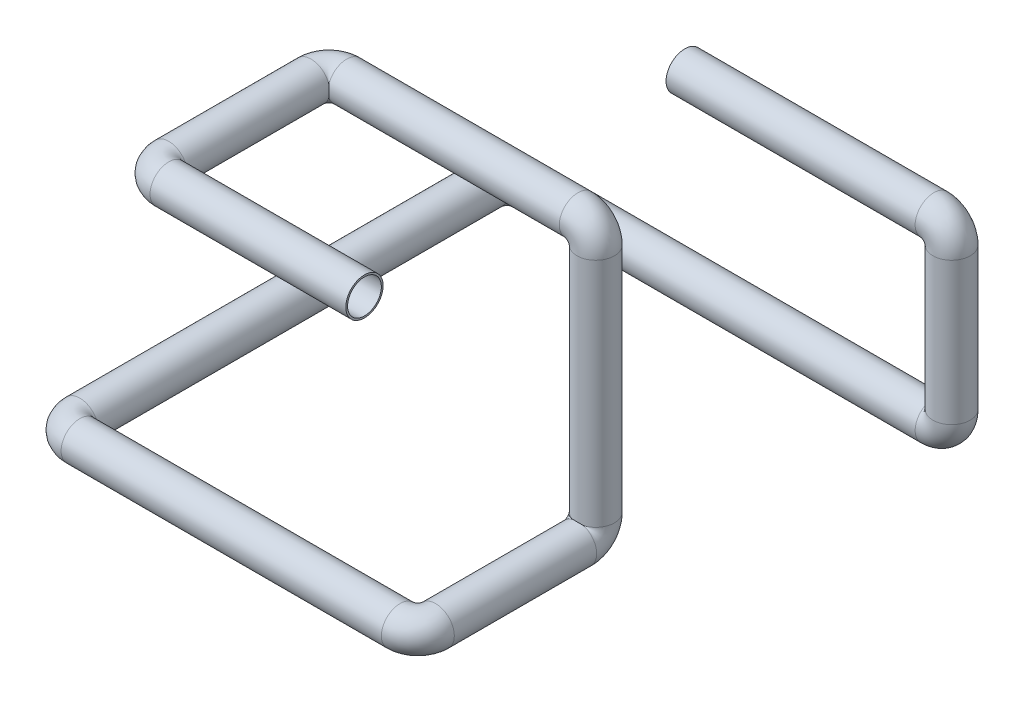
ISO-10303-21;
HEADER;
FILE_DESCRIPTION(('STEP AP214'),'2;1');
FILE_NAME('part.step','',(''),(''),'','','');
FILE_SCHEMA(('AUTOMOTIVE_DESIGN { 1 0 10303 214 1 1 1 1 }'));
ENDSEC;
DATA;
#1=APPLICATION_CONTEXT('core data for automotive mechanical design processes');
#2=APPLICATION_PROTOCOL_DEFINITION('international standard','automotive_design',2000,#1);
#3=PRODUCT_CONTEXT('',#1,'mechanical');
#4=PRODUCT('Part','Part','',(#3));
#5=PRODUCT_RELATED_PRODUCT_CATEGORY('part','',(#4));
#6=PRODUCT_DEFINITION_FORMATION('','',#4);
#7=PRODUCT_DEFINITION_CONTEXT('part definition',#1,'design');
#8=PRODUCT_DEFINITION('design','',#6,#7);
#9=PRODUCT_DEFINITION_SHAPE('','',#8);
#10=(LENGTH_UNIT() NAMED_UNIT(*) SI_UNIT(.MILLI.,.METRE.));
#11=(NAMED_UNIT(*) PLANE_ANGLE_UNIT() SI_UNIT($,.RADIAN.));
#12=(NAMED_UNIT(*) SI_UNIT($,.STERADIAN.) SOLID_ANGLE_UNIT());
#13=UNCERTAINTY_MEASURE_WITH_UNIT(LENGTH_MEASURE(1.E-05),#10,'distance_accuracy_value','');
#14=(GEOMETRIC_REPRESENTATION_CONTEXT(3) GLOBAL_UNCERTAINTY_ASSIGNED_CONTEXT((#13)) GLOBAL_UNIT_ASSIGNED_CONTEXT((#10,
#11,#12)) REPRESENTATION_CONTEXT('',''));
#15=CARTESIAN_POINT('',(0.,0.,0.));
#16=DIRECTION('',(0.,0.,1.));
#17=DIRECTION('',(1.,0.,0.));
#18=AXIS2_PLACEMENT_3D('',#15,#16,#17);
#19=CARTESIAN_POINT('',(0.,0.,0.));
#20=DIRECTION('',(1.,0.,0.));
#21=DIRECTION('',(0.,0.,-1.));
#22=AXIS2_PLACEMENT_3D('',#19,#20,#21);
#23=CYLINDRICAL_SURFACE('',#22,9.49999999999998);
#24=CARTESIAN_POINT('',(140.,0.,0.));
#25=DIRECTION('',(1.,0.,0.));
#26=DIRECTION('',(0.,0.,-1.));
#27=AXIS2_PLACEMENT_3D('',#24,#25,#26);
#28=CIRCLE('',#27,9.49999999999998);
#29=CARTESIAN_POINT('',(140.,9.49999999999998,0.));
#30=VERTEX_POINT('',#29);
#31=EDGE_CURVE('E286',#30,#30,#28,.F.);
#32=ORIENTED_EDGE('',*,*,#31,.F.);
#33=EDGE_LOOP('',(#32));
#34=FACE_BOUND('',#33,.T.);
#35=CARTESIAN_POINT('',(0.,0.,0.));
#36=DIRECTION('',(-1.,0.,0.));
#37=DIRECTION('',(0.,0.,1.));
#38=AXIS2_PLACEMENT_3D('',#35,#36,#37);
#39=CIRCLE('',#38,9.49999999999998);
#40=CARTESIAN_POINT('',(0.,0.,9.49999999999999));
#41=VERTEX_POINT('',#40);
#42=EDGE_CURVE('E283',#41,#41,#39,.T.);
#43=ORIENTED_EDGE('',*,*,#42,.T.);
#44=EDGE_LOOP('',(#43));
#45=FACE_BOUND('',#44,.T.);
#46=ADVANCED_FACE('F51',(#34,#45),#23,.F.);
#47=CARTESIAN_POINT('',(140.,-10.,0.));
#48=DIRECTION('',(0.,0.,-1.));
#49=DIRECTION('',(-1.,0.,0.));
#50=AXIS2_PLACEMENT_3D('',#47,#48,#49);
#51=TOROIDAL_SURFACE('',#50,10.,9.49999999999998);
#52=CARTESIAN_POINT('',(150.,-9.99999999999999,0.));
#53=DIRECTION('',(0.,1.,0.));
#54=DIRECTION('',(-1.,0.,0.));
#55=AXIS2_PLACEMENT_3D('',#52,#53,#54);
#56=CIRCLE('',#55,9.49999999999998);
#57=CARTESIAN_POINT('',(159.5,-9.99999999999999,0.));
#58=VERTEX_POINT('',#57);
#59=EDGE_CURVE('E290',#58,#58,#56,.T.);
#60=CARTESIAN_POINT('',(140.,-10.,0.));
#61=DIRECTION('',(0.,0.,-1.));
#62=DIRECTION('',(-1.,0.,0.));
#63=AXIS2_PLACEMENT_3D('',#60,#61,#62);
#64=CIRCLE('',#63,19.5);
#65=EDGE_CURVE('',#30,#58,#64,.T.);
#66=ORIENTED_EDGE('',*,*,#31,.T.);
#67=ORIENTED_EDGE('',*,*,#59,.F.);
#68=ORIENTED_EDGE('',*,*,#65,.T.);
#69=ORIENTED_EDGE('',*,*,#65,.F.);
#70=EDGE_LOOP('',(#66,#68,#67,#69));
#71=FACE_BOUND('',#70,.T.);
#72=ADVANCED_FACE('F369',(#71),#51,.F.);
#73=CARTESIAN_POINT('',(150.,-9.99999999999999,0.));
#74=DIRECTION('',(0.,-1.,0.));
#75=DIRECTION('',(0.,0.,-1.));
#76=AXIS2_PLACEMENT_3D('',#73,#74,#75);
#77=CYLINDRICAL_SURFACE('',#76,9.49999999999998);
#78=CARTESIAN_POINT('',(150.,-90.,0.));
#79=DIRECTION('',(0.,-1.,0.));
#80=DIRECTION('',(0.,0.,-1.));
#81=AXIS2_PLACEMENT_3D('',#78,#79,#80);
#82=CIRCLE('',#81,9.49999999999998);
#83=CARTESIAN_POINT('',(159.5,-90.,0.));
#84=VERTEX_POINT('',#83);
#85=EDGE_CURVE('E359',#84,#84,#82,.F.);
#86=ORIENTED_EDGE('',*,*,#85,.F.);
#87=EDGE_LOOP('',(#86));
#88=FACE_BOUND('',#87,.T.);
#89=ORIENTED_EDGE('',*,*,#59,.T.);
#90=EDGE_LOOP('',(#89));
#91=FACE_BOUND('',#90,.T.);
#92=ADVANCED_FACE('F367',(#88,#91),#77,.F.);
#93=CARTESIAN_POINT('',(140.,-90.,0.));
#94=DIRECTION('',(0.,0.,-1.));
#95=DIRECTION('',(-1.,0.,0.));
#96=AXIS2_PLACEMENT_3D('',#93,#94,#95);
#97=TOROIDAL_SURFACE('',#96,9.99999999999998,9.49999999999998);
#98=CARTESIAN_POINT('',(140.,-100.,0.));
#99=DIRECTION('',(1.,0.,0.));
#100=DIRECTION('',(0.,1.,0.));
#101=AXIS2_PLACEMENT_3D('',#98,#99,#100);
#102=CIRCLE('',#101,9.49999999999998);
#103=CARTESIAN_POINT('',(140.,-109.5,0.));
#104=VERTEX_POINT('',#103);
#105=EDGE_CURVE('E355',#104,#104,#102,.T.);
#106=CARTESIAN_POINT('',(140.,-90.,0.));
#107=DIRECTION('',(0.,0.,-1.));
#108=DIRECTION('',(-1.,0.,0.));
#109=AXIS2_PLACEMENT_3D('',#106,#107,#108);
#110=CIRCLE('',#109,19.5);
#111=EDGE_CURVE('',#84,#104,#110,.T.);
#112=ORIENTED_EDGE('',*,*,#85,.T.);
#113=ORIENTED_EDGE('',*,*,#105,.F.);
#114=ORIENTED_EDGE('',*,*,#111,.T.);
#115=ORIENTED_EDGE('',*,*,#111,.F.);
#116=EDGE_LOOP('',(#112,#114,#113,#115));
#117=FACE_BOUND('',#116,.T.);
#118=ADVANCED_FACE('F382',(#117),#97,.F.);
#119=CARTESIAN_POINT('',(140.,-100.,0.));
#120=DIRECTION('',(-1.,0.,0.));
#121=DIRECTION('',(0.,0.,1.));
#122=AXIS2_PLACEMENT_3D('',#119,#120,#121);
#123=CYLINDRICAL_SURFACE('',#122,9.49999999999998);
#124=CARTESIAN_POINT('',(-90.,-100.,0.));
#125=DIRECTION('',(-1.,0.,0.));
#126=DIRECTION('',(0.,0.,1.));
#127=AXIS2_PLACEMENT_3D('',#124,#125,#126);
#128=CIRCLE('',#127,9.49999999999998);
#129=CARTESIAN_POINT('',(-90.,-100.,-9.49999999999997));
#130=VERTEX_POINT('',#129);
#131=EDGE_CURVE('E351',#130,#130,#128,.F.);
#132=ORIENTED_EDGE('',*,*,#131,.F.);
#133=EDGE_LOOP('',(#132));
#134=FACE_BOUND('',#133,.T.);
#135=ORIENTED_EDGE('',*,*,#105,.T.);
#136=EDGE_LOOP('',(#135));
#137=FACE_BOUND('',#136,.T.);
#138=ADVANCED_FACE('F386',(#134,#137),#123,.F.);
#139=CARTESIAN_POINT('',(-90.,-100.,10.));
#140=DIRECTION('',(0.,1.,0.));
#141=DIRECTION('',(0.,0.,1.));
#142=AXIS2_PLACEMENT_3D('',#139,#140,#141);
#143=TOROIDAL_SURFACE('',#142,9.99999999999999,9.49999999999998);
#144=CARTESIAN_POINT('',(-100.,-100.,10.));
#145=DIRECTION('',(0.,0.,-1.));
#146=DIRECTION('',(-1.,0.,0.));
#147=AXIS2_PLACEMENT_3D('',#144,#145,#146);
#148=CIRCLE('',#147,9.49999999999998);
#149=CARTESIAN_POINT('',(-109.5,-100.,9.99999999999999));
#150=VERTEX_POINT('',#149);
#151=EDGE_CURVE('E347',#150,#150,#148,.T.);
#152=CARTESIAN_POINT('',(-90.,-100.,10.));
#153=DIRECTION('',(0.,1.,0.));
#154=DIRECTION('',(0.,0.,1.));
#155=AXIS2_PLACEMENT_3D('',#152,#153,#154);
#156=CIRCLE('',#155,19.5);
#157=EDGE_CURVE('',#130,#150,#156,.T.);
#158=ORIENTED_EDGE('',*,*,#131,.T.);
#159=ORIENTED_EDGE('',*,*,#151,.F.);
#160=ORIENTED_EDGE('',*,*,#157,.T.);
#161=ORIENTED_EDGE('',*,*,#157,.F.);
#162=EDGE_LOOP('',(#158,#160,#159,#161));
#163=FACE_BOUND('',#162,.T.);
#164=ADVANCED_FACE('F390',(#163),#143,.F.);
#165=CARTESIAN_POINT('',(-100.,-100.,9.99999999999999));
#166=DIRECTION('',(0.,0.,1.));
#167=DIRECTION('',(1.,0.,0.));
#168=AXIS2_PLACEMENT_3D('',#165,#166,#167);
#169=CYLINDRICAL_SURFACE('',#168,9.49999999999998);
#170=CARTESIAN_POINT('',(-100.,-100.,240.));
#171=DIRECTION('',(0.,0.,1.));
#172=DIRECTION('',(1.,0.,0.));
#173=AXIS2_PLACEMENT_3D('',#170,#171,#172);
#174=CIRCLE('',#173,9.49999999999998);
#175=CARTESIAN_POINT('',(-109.5,-100.,240.));
#176=VERTEX_POINT('',#175);
#177=EDGE_CURVE('E343',#176,#176,#174,.F.);
#178=ORIENTED_EDGE('',*,*,#177,.F.);
#179=EDGE_LOOP('',(#178));
#180=FACE_BOUND('',#179,.T.);
#181=ORIENTED_EDGE('',*,*,#151,.T.);
#182=EDGE_LOOP('',(#181));
#183=FACE_BOUND('',#182,.T.);
#184=ADVANCED_FACE('F394',(#180,#183),#169,.F.);
#185=CARTESIAN_POINT('',(-90.,-100.,240.));
#186=DIRECTION('',(0.,1.,0.));
#187=DIRECTION('',(0.,0.,1.));
#188=AXIS2_PLACEMENT_3D('',#185,#186,#187);
#189=TOROIDAL_SURFACE('',#188,9.99999999999999,9.49999999999998);
#190=CARTESIAN_POINT('',(-90.,-100.,250.));
#191=DIRECTION('',(-1.,0.,0.));
#192=DIRECTION('',(0.,0.,1.));
#193=AXIS2_PLACEMENT_3D('',#190,#191,#192);
#194=CIRCLE('',#193,9.49999999999998);
#195=CARTESIAN_POINT('',(-90.,-100.,259.5));
#196=VERTEX_POINT('',#195);
#197=EDGE_CURVE('E339',#196,#196,#194,.T.);
#198=CARTESIAN_POINT('',(-90.,-100.,240.));
#199=DIRECTION('',(0.,1.,0.));
#200=DIRECTION('',(0.,0.,1.));
#201=AXIS2_PLACEMENT_3D('',#198,#199,#200);
#202=CIRCLE('',#201,19.5);
#203=EDGE_CURVE('',#176,#196,#202,.T.);
#204=ORIENTED_EDGE('',*,*,#177,.T.);
#205=ORIENTED_EDGE('',*,*,#197,.F.);
#206=ORIENTED_EDGE('',*,*,#203,.T.);
#207=ORIENTED_EDGE('',*,*,#203,.F.);
#208=EDGE_LOOP('',(#204,#206,#205,#207));
#209=FACE_BOUND('',#208,.T.);
#210=ADVANCED_FACE('F398',(#209),#189,.F.);
#211=CARTESIAN_POINT('',(-90.,-100.,250.));
#212=DIRECTION('',(1.,0.,0.));
#213=DIRECTION('',(0.,0.,-1.));
#214=AXIS2_PLACEMENT_3D('',#211,#212,#213);
#215=CYLINDRICAL_SURFACE('',#214,9.49999999999998);
#216=CARTESIAN_POINT('',(89.9999999999999,-100.,250.));
#217=DIRECTION('',(1.,0.,0.));
#218=DIRECTION('',(0.,0.,-1.));
#219=AXIS2_PLACEMENT_3D('',#216,#217,#218);
#220=CIRCLE('',#219,9.49999999999998);
#221=CARTESIAN_POINT('',(89.9999999999999,-100.,259.5));
#222=VERTEX_POINT('',#221);
#223=EDGE_CURVE('E335',#222,#222,#220,.F.);
#224=ORIENTED_EDGE('',*,*,#223,.F.);
#225=EDGE_LOOP('',(#224));
#226=FACE_BOUND('',#225,.T.);
#227=ORIENTED_EDGE('',*,*,#197,.T.);
#228=EDGE_LOOP('',(#227));
#229=FACE_BOUND('',#228,.T.);
#230=ADVANCED_FACE('F402',(#226,#229),#215,.F.);
#231=CARTESIAN_POINT('',(90.,-100.,240.));
#232=DIRECTION('',(0.,1.,0.));
#233=DIRECTION('',(0.,0.,1.));
#234=AXIS2_PLACEMENT_3D('',#231,#232,#233);
#235=TOROIDAL_SURFACE('',#234,10.,9.49999999999998);
#236=CARTESIAN_POINT('',(100.,-100.,240.));
#237=DIRECTION('',(0.,0.,1.));
#238=DIRECTION('',(1.,0.,0.));
#239=AXIS2_PLACEMENT_3D('',#236,#237,#238);
#240=CIRCLE('',#239,9.49999999999998);
#241=CARTESIAN_POINT('',(109.5,-100.,240.));
#242=VERTEX_POINT('',#241);
#243=EDGE_CURVE('E331',#242,#242,#240,.T.);
#244=CARTESIAN_POINT('',(90.,-100.,240.));
#245=DIRECTION('',(0.,1.,0.));
#246=DIRECTION('',(0.,0.,1.));
#247=AXIS2_PLACEMENT_3D('',#244,#245,#246);
#248=CIRCLE('',#247,19.5);
#249=EDGE_CURVE('',#222,#242,#248,.T.);
#250=ORIENTED_EDGE('',*,*,#223,.T.);
#251=ORIENTED_EDGE('',*,*,#243,.F.);
#252=ORIENTED_EDGE('',*,*,#249,.T.);
#253=ORIENTED_EDGE('',*,*,#249,.F.);
#254=EDGE_LOOP('',(#250,#252,#251,#253));
#255=FACE_BOUND('',#254,.T.);
#256=ADVANCED_FACE('F406',(#255),#235,.F.);
#257=CARTESIAN_POINT('',(100.,-100.,240.));
#258=DIRECTION('',(0.,0.,-1.));
#259=DIRECTION('',(-1.,0.,0.));
#260=AXIS2_PLACEMENT_3D('',#257,#258,#259);
#261=CYLINDRICAL_SURFACE('',#260,9.49999999999998);
#262=CARTESIAN_POINT('',(100.,-100.,160.));
#263=DIRECTION('',(0.,0.,-1.));
#264=DIRECTION('',(-1.,0.,0.));
#265=AXIS2_PLACEMENT_3D('',#262,#263,#264);
#266=CIRCLE('',#265,9.49999999999998);
#267=CARTESIAN_POINT('',(100.,-109.5,160.));
#268=VERTEX_POINT('',#267);
#269=EDGE_CURVE('E327',#268,#268,#266,.F.);
#270=ORIENTED_EDGE('',*,*,#269,.F.);
#271=EDGE_LOOP('',(#270));
#272=FACE_BOUND('',#271,.T.);
#273=ORIENTED_EDGE('',*,*,#243,.T.);
#274=EDGE_LOOP('',(#273));
#275=FACE_BOUND('',#274,.T.);
#276=ADVANCED_FACE('F410',(#272,#275),#261,.F.);
#277=CARTESIAN_POINT('',(100.,-90.,160.));
#278=DIRECTION('',(1.,0.,0.));
#279=DIRECTION('',(0.,0.,-1.));
#280=AXIS2_PLACEMENT_3D('',#277,#278,#279);
#281=TOROIDAL_SURFACE('',#280,9.99999999999999,9.49999999999998);
#282=CARTESIAN_POINT('',(100.,-90.,150.));
#283=DIRECTION('',(0.,-1.,0.));
#284=DIRECTION('',(0.,0.,-1.));
#285=AXIS2_PLACEMENT_3D('',#282,#283,#284);
#286=CIRCLE('',#285,9.49999999999998);
#287=CARTESIAN_POINT('',(100.,-90.,140.5));
#288=VERTEX_POINT('',#287);
#289=EDGE_CURVE('E323',#288,#288,#286,.T.);
#290=CARTESIAN_POINT('',(100.,-90.,160.));
#291=DIRECTION('',(1.,0.,0.));
#292=DIRECTION('',(0.,0.,-1.));
#293=AXIS2_PLACEMENT_3D('',#290,#291,#292);
#294=CIRCLE('',#293,19.5);
#295=EDGE_CURVE('',#268,#288,#294,.T.);
#296=ORIENTED_EDGE('',*,*,#269,.T.);
#297=ORIENTED_EDGE('',*,*,#289,.F.);
#298=ORIENTED_EDGE('',*,*,#295,.T.);
#299=ORIENTED_EDGE('',*,*,#295,.F.);
#300=EDGE_LOOP('',(#296,#298,#297,#299));
#301=FACE_BOUND('',#300,.T.);
#302=ADVANCED_FACE('F414',(#301),#281,.F.);
#303=CARTESIAN_POINT('',(100.,-90.,150.));
#304=DIRECTION('',(0.,1.,0.));
#305=DIRECTION('',(0.,0.,1.));
#306=AXIS2_PLACEMENT_3D('',#303,#304,#305);
#307=CYLINDRICAL_SURFACE('',#306,9.49999999999998);
#308=CARTESIAN_POINT('',(100.,40.,150.));
#309=DIRECTION('',(0.,1.,0.));
#310=DIRECTION('',(0.,0.,1.));
#311=AXIS2_PLACEMENT_3D('',#308,#309,#310);
#312=CIRCLE('',#311,9.49999999999998);
#313=CARTESIAN_POINT('',(109.5,40.,150.));
#314=VERTEX_POINT('',#313);
#315=EDGE_CURVE('E319',#314,#314,#312,.F.);
#316=ORIENTED_EDGE('',*,*,#315,.F.);
#317=EDGE_LOOP('',(#316));
#318=FACE_BOUND('',#317,.T.);
#319=ORIENTED_EDGE('',*,*,#289,.T.);
#320=EDGE_LOOP('',(#319));
#321=FACE_BOUND('',#320,.T.);
#322=ADVANCED_FACE('F418',(#318,#321),#307,.F.);
#323=CARTESIAN_POINT('',(90.,40.,150.));
#324=DIRECTION('',(0.,0.,1.));
#325=DIRECTION('',(1.,0.,0.));
#326=AXIS2_PLACEMENT_3D('',#323,#324,#325);
#327=TOROIDAL_SURFACE('',#326,9.99999999999999,9.49999999999998);
#328=CARTESIAN_POINT('',(90.,50.,150.));
#329=DIRECTION('',(1.,0.,0.));
#330=DIRECTION('',(0.,1.,0.));
#331=AXIS2_PLACEMENT_3D('',#328,#329,#330);
#332=CIRCLE('',#331,9.49999999999998);
#333=CARTESIAN_POINT('',(90.,59.5,150.));
#334=VERTEX_POINT('',#333);
#335=EDGE_CURVE('E315',#334,#334,#332,.T.);
#336=CARTESIAN_POINT('',(90.,40.,150.));
#337=DIRECTION('',(0.,0.,1.));
#338=DIRECTION('',(1.,0.,0.));
#339=AXIS2_PLACEMENT_3D('',#336,#337,#338);
#340=CIRCLE('',#339,19.5);
#341=EDGE_CURVE('',#314,#334,#340,.T.);
#342=ORIENTED_EDGE('',*,*,#315,.T.);
#343=ORIENTED_EDGE('',*,*,#335,.F.);
#344=ORIENTED_EDGE('',*,*,#341,.T.);
#345=ORIENTED_EDGE('',*,*,#341,.F.);
#346=EDGE_LOOP('',(#342,#344,#343,#345));
#347=FACE_BOUND('',#346,.T.);
#348=ADVANCED_FACE('F422',(#347),#327,.F.);
#349=CARTESIAN_POINT('',(90.,50.,150.));
#350=DIRECTION('',(-1.,0.,0.));
#351=DIRECTION('',(0.,-1.,0.));
#352=AXIS2_PLACEMENT_3D('',#349,#350,#351);
#353=CYLINDRICAL_SURFACE('',#352,9.49999999999998);
#354=CARTESIAN_POINT('',(-40.,50.,150.));
#355=DIRECTION('',(-1.,0.,0.));
#356=DIRECTION('',(0.,-1.,0.));
#357=AXIS2_PLACEMENT_3D('',#354,#355,#356);
#358=CIRCLE('',#357,9.49999999999998);
#359=CARTESIAN_POINT('',(-40.,50.,140.5));
#360=VERTEX_POINT('',#359);
#361=EDGE_CURVE('E309',#360,#360,#358,.F.);
#362=ORIENTED_EDGE('',*,*,#361,.F.);
#363=EDGE_LOOP('',(#362));
#364=FACE_BOUND('',#363,.T.);
#365=ORIENTED_EDGE('',*,*,#335,.T.);
#366=EDGE_LOOP('',(#365));
#367=FACE_BOUND('',#366,.T.);
#368=ADVANCED_FACE('F426',(#364,#367),#353,.F.);
#369=CARTESIAN_POINT('',(-40.,50.,160.));
#370=DIRECTION('',(0.,1.,0.));
#371=DIRECTION('',(0.,0.,1.));
#372=AXIS2_PLACEMENT_3D('',#369,#370,#371);
#373=TOROIDAL_SURFACE('',#372,10.,9.49999999999998);
#374=CARTESIAN_POINT('',(-50.,50.,160.));
#375=DIRECTION('',(0.,0.,-1.));
#376=DIRECTION('',(-1.,0.,0.));
#377=AXIS2_PLACEMENT_3D('',#374,#375,#376);
#378=CIRCLE('',#377,9.49999999999998);
#379=CARTESIAN_POINT('',(-59.5,50.,160.));
#380=VERTEX_POINT('',#379);
#381=EDGE_CURVE('E304',#380,#380,#378,.T.);
#382=CARTESIAN_POINT('',(-40.,50.,160.));
#383=DIRECTION('',(0.,1.,0.));
#384=DIRECTION('',(0.,0.,1.));
#385=AXIS2_PLACEMENT_3D('',#382,#383,#384);
#386=CIRCLE('',#385,19.5);
#387=EDGE_CURVE('',#360,#380,#386,.T.);
#388=ORIENTED_EDGE('',*,*,#361,.T.);
#389=ORIENTED_EDGE('',*,*,#381,.F.);
#390=ORIENTED_EDGE('',*,*,#387,.T.);
#391=ORIENTED_EDGE('',*,*,#387,.F.);
#392=EDGE_LOOP('',(#388,#390,#389,#391));
#393=FACE_BOUND('',#392,.T.);
#394=ADVANCED_FACE('F430',(#393),#373,.F.);
#395=CARTESIAN_POINT('',(-50.,50.,160.));
#396=DIRECTION('',(0.,0.,1.));
#397=DIRECTION('',(1.,0.,0.));
#398=AXIS2_PLACEMENT_3D('',#395,#396,#397);
#399=CYLINDRICAL_SURFACE('',#398,9.49999999999998);
#400=CARTESIAN_POINT('',(-50.,50.,240.));
#401=DIRECTION('',(0.,0.,1.));
#402=DIRECTION('',(1.,0.,0.));
#403=AXIS2_PLACEMENT_3D('',#400,#401,#402);
#404=CIRCLE('',#403,9.49999999999998);
#405=CARTESIAN_POINT('',(-59.5,50.,240.));
#406=VERTEX_POINT('',#405);
#407=EDGE_CURVE('E300',#406,#406,#404,.F.);
#408=ORIENTED_EDGE('',*,*,#407,.F.);
#409=EDGE_LOOP('',(#408));
#410=FACE_BOUND('',#409,.T.);
#411=ORIENTED_EDGE('',*,*,#381,.T.);
#412=EDGE_LOOP('',(#411));
#413=FACE_BOUND('',#412,.T.);
#414=ADVANCED_FACE('F257',(#410,#413),#399,.F.);
#415=CARTESIAN_POINT('',(-40.,50.,240.));
#416=DIRECTION('',(0.,1.,0.));
#417=DIRECTION('',(-1.,0.,0.));
#418=AXIS2_PLACEMENT_3D('',#415,#416,#417);
#419=TOROIDAL_SURFACE('',#418,10.,9.49999999999998);
#420=CARTESIAN_POINT('',(-39.9999999999999,50.,250.));
#421=DIRECTION('',(-1.,0.,0.));
#422=DIRECTION('',(0.,0.,1.));
#423=AXIS2_PLACEMENT_3D('',#420,#421,#422);
#424=CIRCLE('',#423,9.49999999999998);
#425=CARTESIAN_POINT('',(-39.9999999999998,50.,259.5));
#426=VERTEX_POINT('',#425);
#427=EDGE_CURVE('E293',#426,#426,#424,.T.);
#428=CARTESIAN_POINT('',(-40.,50.,240.));
#429=DIRECTION('',(0.,1.,0.));
#430=DIRECTION('',(-1.,0.,0.));
#431=AXIS2_PLACEMENT_3D('',#428,#429,#430);
#432=CIRCLE('',#431,19.5);
#433=EDGE_CURVE('',#406,#426,#432,.T.);
#434=ORIENTED_EDGE('',*,*,#407,.T.);
#435=ORIENTED_EDGE('',*,*,#427,.F.);
#436=ORIENTED_EDGE('',*,*,#433,.T.);
#437=ORIENTED_EDGE('',*,*,#433,.F.);
#438=EDGE_LOOP('',(#434,#436,#435,#437));
#439=FACE_BOUND('',#438,.T.);
#440=ADVANCED_FACE('F250',(#439),#419,.F.);
#441=CARTESIAN_POINT('',(-40.,50.,250.));
#442=DIRECTION('',(1.,0.,0.));
#443=DIRECTION('',(0.,1.,0.));
#444=AXIS2_PLACEMENT_3D('',#441,#442,#443);
#445=CYLINDRICAL_SURFACE('',#444,9.49999999999998);
#446=CARTESIAN_POINT('',(70.,50.,250.));
#447=DIRECTION('',(-1.,0.,0.));
#448=DIRECTION('',(0.,-1.,0.));
#449=AXIS2_PLACEMENT_3D('',#446,#447,#448);
#450=CIRCLE('',#449,9.49999999999998);
#451=CARTESIAN_POINT('',(70.,40.5,250.));
#452=VERTEX_POINT('',#451);
#453=EDGE_CURVE('E213',#452,#452,#450,.T.);
#454=ORIENTED_EDGE('',*,*,#453,.F.);
#455=EDGE_LOOP('',(#454));
#456=FACE_BOUND('',#455,.T.);
#457=ORIENTED_EDGE('',*,*,#427,.T.);
#458=EDGE_LOOP('',(#457));
#459=FACE_BOUND('',#458,.T.);
#460=ADVANCED_FACE('F248',(#456,#459),#445,.F.);
#461=CARTESIAN_POINT('',(150.,-9.99999999999999,0.));
#462=DIRECTION('',(0.,-1.,0.));
#463=DIRECTION('',(0.,0.,-1.));
#464=AXIS2_PLACEMENT_3D('',#461,#462,#463);
#465=CYLINDRICAL_SURFACE('',#464,10.5);
#466=CARTESIAN_POINT('',(150.,-100.,0.));
#467=DIRECTION('',(-0.707106781186547,-0.707106781186547,0.));
#468=DIRECTION('',(0.707106781186547,-0.707106781186547,0.));
#469=AXIS2_PLACEMENT_3D('',#466,#467,#468);
#470=ELLIPSE('',#469,14.8492424049175,10.5);
#471=CARTESIAN_POINT('',(140.,-90.,3.20156211871638));
#472=VERTEX_POINT('',#471);
#473=CARTESIAN_POINT('',(140.,-90.,-3.20156211871642));
#474=VERTEX_POINT('',#473);
#475=EDGE_CURVE('E60',#472,#474,#470,.T.);
#476=ORIENTED_EDGE('',*,*,#475,.F.);
#477=CARTESIAN_POINT('',(150.,-90.,0.));
#478=DIRECTION('',(0.,-1.,0.));
#479=DIRECTION('',(0.,0.,-1.));
#480=AXIS2_PLACEMENT_3D('',#477,#478,#479);
#481=CIRCLE('',#480,10.5);
#482=EDGE_CURVE('E135',#472,#474,#481,.F.);
#483=ORIENTED_EDGE('',*,*,#482,.T.);
#484=EDGE_LOOP('',(#476,#483));
#485=FACE_BOUND('',#484,.T.);
#486=CARTESIAN_POINT('',(150.,-9.99999999999999,0.));
#487=DIRECTION('',(0.,1.,0.));
#488=DIRECTION('',(-1.,0.,0.));
#489=AXIS2_PLACEMENT_3D('',#486,#487,#488);
#490=CIRCLE('',#489,10.5);
#491=CARTESIAN_POINT('',(140.,-10.,3.20156211871623));
#492=VERTEX_POINT('',#491);
#493=CARTESIAN_POINT('',(140.,-10.,-3.20156211871636));
#494=VERTEX_POINT('',#493);
#495=EDGE_CURVE('E129',#492,#494,#490,.T.);
#496=ORIENTED_EDGE('',*,*,#495,.F.);
#497=CARTESIAN_POINT('',(150.,0.,0.));
#498=DIRECTION('',(0.707106781186547,-0.707106781186547,0.));
#499=DIRECTION('',(0.707106781186547,0.707106781186547,0.));
#500=AXIS2_PLACEMENT_3D('',#497,#498,#499);
#501=ELLIPSE('',#500,14.8492424049175,10.5);
#502=EDGE_CURVE('E12',#492,#494,#501,.T.);
#503=ORIENTED_EDGE('',*,*,#502,.T.);
#504=EDGE_LOOP('',(#496,#503));
#505=FACE_BOUND('',#504,.T.);
#506=ADVANCED_FACE('F133',(#485,#505),#465,.T.);
#507=CARTESIAN_POINT('',(0.,0.,0.));
#508=DIRECTION('',(1.,0.,0.));
#509=DIRECTION('',(0.,0.,-1.));
#510=AXIS2_PLACEMENT_3D('',#507,#508,#509);
#511=CYLINDRICAL_SURFACE('',#510,10.5);
#512=CARTESIAN_POINT('',(0.,0.,0.));
#513=DIRECTION('',(-1.,0.,0.));
#514=DIRECTION('',(0.,0.,1.));
#515=AXIS2_PLACEMENT_3D('',#512,#513,#514);
#516=CIRCLE('',#515,10.5);
#517=CARTESIAN_POINT('',(0.,0.,10.5));
#518=VERTEX_POINT('',#517);
#519=EDGE_CURVE('E131',#518,#518,#516,.T.);
#520=ORIENTED_EDGE('',*,*,#519,.F.);
#521=EDGE_LOOP('',(#520));
#522=FACE_BOUND('',#521,.T.);
#523=ORIENTED_EDGE('',*,*,#502,.F.);
#524=CARTESIAN_POINT('',(140.,0.,0.));
#525=DIRECTION('',(1.,0.,0.));
#526=DIRECTION('',(0.,0.,-1.));
#527=AXIS2_PLACEMENT_3D('',#524,#525,#526);
#528=CIRCLE('',#527,10.5);
#529=EDGE_CURVE('E123',#492,#494,#528,.F.);
#530=ORIENTED_EDGE('',*,*,#529,.T.);
#531=EDGE_LOOP('',(#523,#530));
#532=FACE_BOUND('',#531,.T.);
#533=ADVANCED_FACE('F122',(#522,#532),#511,.T.);
#534=CARTESIAN_POINT('',(140.,-100.,0.));
#535=DIRECTION('',(-1.,0.,0.));
#536=DIRECTION('',(0.,0.,1.));
#537=AXIS2_PLACEMENT_3D('',#534,#535,#536);
#538=CYLINDRICAL_SURFACE('',#537,10.5);
#539=CARTESIAN_POINT('',(-100.,-100.,0.));
#540=DIRECTION('',(-0.707106781186547,0.,0.707106781186548));
#541=DIRECTION('',(-0.707106781186547,0.,-0.707106781186547));
#542=AXIS2_PLACEMENT_3D('',#539,#540,#541);
#543=ELLIPSE('',#542,14.8492424049175,10.5);
#544=CARTESIAN_POINT('',(-90.,-103.201562118716,9.99999999999999));
#545=VERTEX_POINT('',#544);
#546=CARTESIAN_POINT('',(-90.,-96.7984378812836,10.));
#547=VERTEX_POINT('',#546);
#548=EDGE_CURVE('E224',#545,#547,#543,.T.);
#549=ORIENTED_EDGE('',*,*,#548,.F.);
#550=CARTESIAN_POINT('',(-90.,-100.,0.));
#551=DIRECTION('',(-1.,0.,0.));
#552=DIRECTION('',(0.,0.,1.));
#553=AXIS2_PLACEMENT_3D('',#550,#551,#552);
#554=CIRCLE('',#553,10.5);
#555=EDGE_CURVE('E146',#545,#547,#554,.F.);
#556=ORIENTED_EDGE('',*,*,#555,.T.);
#557=EDGE_LOOP('',(#549,#556));
#558=FACE_BOUND('',#557,.T.);
#559=CARTESIAN_POINT('',(140.,-100.,0.));
#560=DIRECTION('',(1.,0.,0.));
#561=DIRECTION('',(0.,1.,0.));
#562=AXIS2_PLACEMENT_3D('',#559,#560,#561);
#563=CIRCLE('',#562,10.5);
#564=EDGE_CURVE('E139',#472,#474,#563,.T.);
#565=ORIENTED_EDGE('',*,*,#564,.F.);
#566=ORIENTED_EDGE('',*,*,#475,.T.);
#567=EDGE_LOOP('',(#565,#566));
#568=FACE_BOUND('',#567,.T.);
#569=ADVANCED_FACE('F229',(#558,#568),#538,.T.);
#570=CARTESIAN_POINT('',(-100.,-100.,9.99999999999999));
#571=DIRECTION('',(0.,0.,1.));
#572=DIRECTION('',(1.,0.,0.));
#573=AXIS2_PLACEMENT_3D('',#570,#571,#572);
#574=CYLINDRICAL_SURFACE('',#573,10.5);
#575=CARTESIAN_POINT('',(-100.,-100.,250.));
#576=DIRECTION('',(0.707106781186547,0.,0.707106781186547));
#577=DIRECTION('',(-0.707106781186547,0.,0.707106781186548));
#578=AXIS2_PLACEMENT_3D('',#575,#576,#577);
#579=ELLIPSE('',#578,14.8492424049175,10.5);
#580=CARTESIAN_POINT('',(-90.,-103.201562118717,240.));
#581=VERTEX_POINT('',#580);
#582=CARTESIAN_POINT('',(-90.,-96.7984378812836,240.));
#583=VERTEX_POINT('',#582);
#584=EDGE_CURVE('E221',#581,#583,#579,.T.);
#585=ORIENTED_EDGE('',*,*,#584,.F.);
#586=CARTESIAN_POINT('',(-100.,-100.,240.));
#587=DIRECTION('',(0.,0.,1.));
#588=DIRECTION('',(1.,0.,0.));
#589=AXIS2_PLACEMENT_3D('',#586,#587,#588);
#590=CIRCLE('',#589,10.5);
#591=EDGE_CURVE('E154',#581,#583,#590,.F.);
#592=ORIENTED_EDGE('',*,*,#591,.T.);
#593=EDGE_LOOP('',(#585,#592));
#594=FACE_BOUND('',#593,.T.);
#595=CARTESIAN_POINT('',(-100.,-100.,10.));
#596=DIRECTION('',(0.,0.,-1.));
#597=DIRECTION('',(-1.,0.,0.));
#598=AXIS2_PLACEMENT_3D('',#595,#596,#597);
#599=CIRCLE('',#598,10.5);
#600=EDGE_CURVE('E150',#545,#547,#599,.T.);
#601=ORIENTED_EDGE('',*,*,#600,.F.);
#602=ORIENTED_EDGE('',*,*,#548,.T.);
#603=EDGE_LOOP('',(#601,#602));
#604=FACE_BOUND('',#603,.T.);
#605=ADVANCED_FACE('F277',(#594,#604),#574,.T.);
#606=CARTESIAN_POINT('',(-90.,-100.,250.));
#607=DIRECTION('',(1.,0.,0.));
#608=DIRECTION('',(0.,0.,-1.));
#609=AXIS2_PLACEMENT_3D('',#606,#607,#608);
#610=CYLINDRICAL_SURFACE('',#609,10.5);
#611=CARTESIAN_POINT('',(100.,-100.,250.));
#612=DIRECTION('',(0.707106781186547,0.,-0.707106781186547));
#613=DIRECTION('',(0.707106781186547,0.,0.707106781186548));
#614=AXIS2_PLACEMENT_3D('',#611,#612,#613);
#615=ELLIPSE('',#614,14.8492424049175,10.5);
#616=CARTESIAN_POINT('',(89.9999999999999,-103.201562118716,240.));
#617=VERTEX_POINT('',#616);
#618=CARTESIAN_POINT('',(90.,-96.7984378812837,240.));
#619=VERTEX_POINT('',#618);
#620=EDGE_CURVE('E73',#617,#619,#615,.T.);
#621=ORIENTED_EDGE('',*,*,#620,.F.);
#622=CARTESIAN_POINT('',(89.9999999999999,-100.,250.));
#623=DIRECTION('',(1.,0.,0.));
#624=DIRECTION('',(0.,0.,-1.));
#625=AXIS2_PLACEMENT_3D('',#622,#623,#624);
#626=CIRCLE('',#625,10.5);
#627=EDGE_CURVE('E162',#617,#619,#626,.F.);
#628=ORIENTED_EDGE('',*,*,#627,.T.);
#629=EDGE_LOOP('',(#621,#628));
#630=FACE_BOUND('',#629,.T.);
#631=CARTESIAN_POINT('',(-90.,-100.,250.));
#632=DIRECTION('',(-1.,0.,0.));
#633=DIRECTION('',(0.,0.,1.));
#634=AXIS2_PLACEMENT_3D('',#631,#632,#633);
#635=CIRCLE('',#634,10.5);
#636=EDGE_CURVE('E158',#581,#583,#635,.T.);
#637=ORIENTED_EDGE('',*,*,#636,.F.);
#638=ORIENTED_EDGE('',*,*,#584,.T.);
#639=EDGE_LOOP('',(#637,#638));
#640=FACE_BOUND('',#639,.T.);
#641=ADVANCED_FACE('F501',(#630,#640),#610,.T.);
#642=CARTESIAN_POINT('',(100.,-100.,240.));
#643=DIRECTION('',(0.,0.,-1.));
#644=DIRECTION('',(-1.,0.,0.));
#645=AXIS2_PLACEMENT_3D('',#642,#643,#644);
#646=CYLINDRICAL_SURFACE('',#645,10.5);
#647=CARTESIAN_POINT('',(100.,-100.,160.));
#648=DIRECTION('',(0.,0.,-1.));
#649=DIRECTION('',(-1.,0.,0.));
#650=AXIS2_PLACEMENT_3D('',#647,#648,#649);
#651=CIRCLE('',#650,10.5);
#652=CARTESIAN_POINT('',(96.7984378812837,-90.,160.));
#653=VERTEX_POINT('',#652);
#654=CARTESIAN_POINT('',(103.201562118717,-90.0000000000001,160.));
#655=VERTEX_POINT('',#654);
#656=EDGE_CURVE('E169',#653,#655,#651,.F.);
#657=ORIENTED_EDGE('',*,*,#656,.T.);
#658=CARTESIAN_POINT('',(100.,-100.,150.));
#659=DIRECTION('',(0.,0.707106781186547,-0.707106781186547));
#660=DIRECTION('',(0.,-0.707106781186547,-0.707106781186547));
#661=AXIS2_PLACEMENT_3D('',#658,#659,#660);
#662=ELLIPSE('',#661,14.8492424049175,10.5);
#663=EDGE_CURVE('E198',#653,#655,#662,.T.);
#664=ORIENTED_EDGE('',*,*,#663,.F.);
#665=EDGE_LOOP('',(#657,#664));
#666=FACE_BOUND('',#665,.T.);
#667=CARTESIAN_POINT('',(100.,-100.,240.));
#668=DIRECTION('',(0.,0.,1.));
#669=DIRECTION('',(1.,0.,0.));
#670=AXIS2_PLACEMENT_3D('',#667,#668,#669);
#671=CIRCLE('',#670,10.5);
#672=EDGE_CURVE('E165',#617,#619,#671,.T.);
#673=ORIENTED_EDGE('',*,*,#672,.F.);
#674=ORIENTED_EDGE('',*,*,#620,.T.);
#675=EDGE_LOOP('',(#673,#674));
#676=FACE_BOUND('',#675,.T.);
#677=ADVANCED_FACE('F511',(#666,#676),#646,.T.);
#678=CARTESIAN_POINT('',(90.,50.,150.));
#679=DIRECTION('',(-1.,0.,0.));
#680=DIRECTION('',(0.,-1.,0.));
#681=AXIS2_PLACEMENT_3D('',#678,#679,#680);
#682=CYLINDRICAL_SURFACE('',#681,10.5);
#683=CARTESIAN_POINT('',(-40.,50.,150.));
#684=DIRECTION('',(-1.,0.,0.));
#685=DIRECTION('',(0.,-1.,0.));
#686=AXIS2_PLACEMENT_3D('',#683,#684,#685);
#687=CIRCLE('',#686,10.5);
#688=CARTESIAN_POINT('',(-40.0000000000001,46.7984378812836,160.));
#689=VERTEX_POINT('',#688);
#690=CARTESIAN_POINT('',(-40.,53.2015621187163,160.));
#691=VERTEX_POINT('',#690);
#692=EDGE_CURVE('E183',#689,#691,#687,.F.);
#693=ORIENTED_EDGE('',*,*,#692,.T.);
#694=CARTESIAN_POINT('',(-50.,50.,150.));
#695=DIRECTION('',(-0.707106781186548,0.,0.707106781186548));
#696=DIRECTION('',(-0.707106781186547,0.,-0.707106781186547));
#697=AXIS2_PLACEMENT_3D('',#694,#695,#696);
#698=ELLIPSE('',#697,14.8492424049175,10.5);
#699=EDGE_CURVE('E202',#689,#691,#698,.T.);
#700=ORIENTED_EDGE('',*,*,#699,.F.);
#701=EDGE_LOOP('',(#693,#700));
#702=FACE_BOUND('',#701,.T.);
#703=CARTESIAN_POINT('',(90.,50.,150.));
#704=DIRECTION('',(1.,0.,0.));
#705=DIRECTION('',(0.,1.,0.));
#706=AXIS2_PLACEMENT_3D('',#703,#704,#705);
#707=CIRCLE('',#706,10.5);
#708=CARTESIAN_POINT('',(90.,40.0000000000001,146.798437881283));
#709=VERTEX_POINT('',#708);
#710=CARTESIAN_POINT('',(90.,40.,153.201562118716));
#711=VERTEX_POINT('',#710);
#712=EDGE_CURVE('E179',#709,#711,#707,.T.);
#713=ORIENTED_EDGE('',*,*,#712,.F.);
#714=CARTESIAN_POINT('',(100.,50.,150.));
#715=DIRECTION('',(-0.707106781186547,0.707106781186548,0.));
#716=DIRECTION('',(0.707106781186548,0.707106781186547,0.));
#717=AXIS2_PLACEMENT_3D('',#714,#715,#716);
#718=ELLIPSE('',#717,14.8492424049175,10.5);
#719=EDGE_CURVE('E66',#709,#711,#718,.T.);
#720=ORIENTED_EDGE('',*,*,#719,.T.);
#721=EDGE_LOOP('',(#713,#720));
#722=FACE_BOUND('',#721,.T.);
#723=ADVANCED_FACE('F521',(#702,#722),#682,.T.);
#724=CARTESIAN_POINT('',(100.,-90.,150.));
#725=DIRECTION('',(0.,1.,0.));
#726=DIRECTION('',(0.,0.,1.));
#727=AXIS2_PLACEMENT_3D('',#724,#725,#726);
#728=CYLINDRICAL_SURFACE('',#727,10.5);
#729=CARTESIAN_POINT('',(100.,-90.,150.));
#730=DIRECTION('',(0.,-1.,0.));
#731=DIRECTION('',(0.,0.,-1.));
#732=AXIS2_PLACEMENT_3D('',#729,#730,#731);
#733=CIRCLE('',#732,10.5);
#734=EDGE_CURVE('E172',#653,#655,#733,.T.);
#735=ORIENTED_EDGE('',*,*,#734,.F.);
#736=ORIENTED_EDGE('',*,*,#663,.T.);
#737=EDGE_LOOP('',(#735,#736));
#738=FACE_BOUND('',#737,.T.);
#739=ORIENTED_EDGE('',*,*,#719,.F.);
#740=CARTESIAN_POINT('',(100.,40.,150.));
#741=DIRECTION('',(0.,1.,0.));
#742=DIRECTION('',(0.,0.,1.));
#743=AXIS2_PLACEMENT_3D('',#740,#741,#742);
#744=CIRCLE('',#743,10.5);
#745=EDGE_CURVE('E176',#709,#711,#744,.F.);
#746=ORIENTED_EDGE('',*,*,#745,.T.);
#747=EDGE_LOOP('',(#739,#746));
#748=FACE_BOUND('',#747,.T.);
#749=ADVANCED_FACE('F270',(#738,#748),#728,.T.);
#750=CARTESIAN_POINT('',(0.,0.,0.));
#751=DIRECTION('',(-1.,0.,0.));
#752=DIRECTION('',(0.,0.,1.));
#753=AXIS2_PLACEMENT_3D('',#750,#751,#752);
#754=PLANE('',#753);
#755=ORIENTED_EDGE('',*,*,#519,.T.);
#756=EDGE_LOOP('',(#755));
#757=FACE_BOUND('',#756,.T.);
#758=ORIENTED_EDGE('',*,*,#42,.F.);
#759=EDGE_LOOP('',(#758));
#760=FACE_BOUND('',#759,.T.);
#761=ADVANCED_FACE('F266',(#757,#760),#754,.T.);
#762=CARTESIAN_POINT('',(70.,50.,250.));
#763=DIRECTION('',(-1.,0.,0.));
#764=DIRECTION('',(0.,-1.,0.));
#765=AXIS2_PLACEMENT_3D('',#762,#763,#764);
#766=PLANE('',#765);
#767=CARTESIAN_POINT('',(70.,50.,250.));
#768=DIRECTION('',(-1.,0.,0.));
#769=DIRECTION('',(0.,-1.,0.));
#770=AXIS2_PLACEMENT_3D('',#767,#768,#769);
#771=CIRCLE('',#770,10.5);
#772=CARTESIAN_POINT('',(70.,39.5,250.));
#773=VERTEX_POINT('',#772);
#774=EDGE_CURVE('E197',#773,#773,#771,.T.);
#775=ORIENTED_EDGE('',*,*,#774,.F.);
#776=EDGE_LOOP('',(#775));
#777=FACE_BOUND('',#776,.T.);
#778=ORIENTED_EDGE('',*,*,#453,.T.);
#779=EDGE_LOOP('',(#778));
#780=FACE_BOUND('',#779,.T.);
#781=ADVANCED_FACE('F244',(#777,#780),#766,.F.);
#782=CARTESIAN_POINT('',(130.,-10.,0.));
#783=DIRECTION('',(0.,-1.,0.));
#784=DIRECTION('',(-1.,0.,0.));
#785=AXIS2_PLACEMENT_3D('',#782,#783,#784);
#786=CIRCLE('',#785,10.5);
#787=TRIMMED_CURVE('',#786,(PARAMETER_VALUE(-2.83174801384817)),
(PARAMETER_VALUE(2.83174801384817)),.T.,.PARAMETER.);
#788=CARTESIAN_POINT('',(140.,-10.,0.));
#789=DIRECTION('',(0.,0.,-1.));
#790=AXIS1_PLACEMENT('',#788,#789);
#791=SURFACE_OF_REVOLUTION('',#787,#790);
#792=ORIENTED_EDGE('',*,*,#495,.T.);
#793=ORIENTED_EDGE('',*,*,#529,.F.);
#794=EDGE_LOOP('',(#792,#793));
#795=FACE_BOUND('',#794,.T.);
#796=ADVANCED_FACE('F128',(#795),#791,.T.);
#797=CARTESIAN_POINT('',(130.,-90.,0.));
#798=DIRECTION('',(0.,-1.,0.));
#799=DIRECTION('',(-1.,0.,0.));
#800=AXIS2_PLACEMENT_3D('',#797,#798,#799);
#801=CIRCLE('',#800,10.5);
#802=TRIMMED_CURVE('',#801,(PARAMETER_VALUE(-2.83174801384817)),
(PARAMETER_VALUE(2.83174801384817)),.T.,.PARAMETER.);
#803=CARTESIAN_POINT('',(140.,-90.,0.));
#804=DIRECTION('',(0.,0.,-1.));
#805=AXIS1_PLACEMENT('',#803,#804);
#806=SURFACE_OF_REVOLUTION('',#802,#805);
#807=ORIENTED_EDGE('',*,*,#564,.T.);
#808=ORIENTED_EDGE('',*,*,#482,.F.);
#809=EDGE_LOOP('',(#807,#808));
#810=FACE_BOUND('',#809,.T.);
#811=ADVANCED_FACE('F233',(#810),#806,.T.);
#812=CARTESIAN_POINT('',(-90.,-100.,20.));
#813=DIRECTION('',(-1.,0.,0.));
#814=DIRECTION('',(0.,0.,1.));
#815=AXIS2_PLACEMENT_3D('',#812,#813,#814);
#816=CIRCLE('',#815,10.5);
#817=TRIMMED_CURVE('',#816,(PARAMETER_VALUE(-2.83174801384817)),
(PARAMETER_VALUE(2.83174801384817)),.T.,.PARAMETER.);
#818=CARTESIAN_POINT('',(-90.,-100.,10.));
#819=DIRECTION('',(0.,1.,0.));
#820=AXIS1_PLACEMENT('',#818,#819);
#821=SURFACE_OF_REVOLUTION('',#817,#820);
#822=ORIENTED_EDGE('',*,*,#600,.T.);
#823=ORIENTED_EDGE('',*,*,#555,.F.);
#824=EDGE_LOOP('',(#822,#823));
#825=FACE_BOUND('',#824,.T.);
#826=ADVANCED_FACE('F235',(#825),#821,.T.);
#827=CARTESIAN_POINT('',(-90.,-100.,250.));
#828=DIRECTION('',(-1.,0.,0.));
#829=DIRECTION('',(0.,0.,1.));
#830=AXIS2_PLACEMENT_3D('',#827,#828,#829);
#831=CIRCLE('',#830,10.5);
#832=TRIMMED_CURVE('',#831,(PARAMETER_VALUE(-2.83174801384817)),
(PARAMETER_VALUE(2.83174801384817)),.T.,.PARAMETER.);
#833=CARTESIAN_POINT('',(-90.,-100.,240.));
#834=DIRECTION('',(0.,1.,0.));
#835=AXIS1_PLACEMENT('',#833,#834);
#836=SURFACE_OF_REVOLUTION('',#832,#835);
#837=ORIENTED_EDGE('',*,*,#636,.T.);
#838=ORIENTED_EDGE('',*,*,#591,.F.);
#839=EDGE_LOOP('',(#837,#838));
#840=FACE_BOUND('',#839,.T.);
#841=ADVANCED_FACE('F241',(#840),#836,.T.);
#842=CARTESIAN_POINT('',(90.,-100.,250.));
#843=DIRECTION('',(-1.,0.,0.));
#844=DIRECTION('',(0.,0.,1.));
#845=AXIS2_PLACEMENT_3D('',#842,#843,#844);
#846=CIRCLE('',#845,10.5);
#847=TRIMMED_CURVE('',#846,(PARAMETER_VALUE(-2.83174801384817)),
(PARAMETER_VALUE(2.83174801384817)),.T.,.PARAMETER.);
#848=CARTESIAN_POINT('',(90.,-100.,240.));
#849=DIRECTION('',(0.,1.,0.));
#850=AXIS1_PLACEMENT('',#848,#849);
#851=SURFACE_OF_REVOLUTION('',#847,#850);
#852=ORIENTED_EDGE('',*,*,#672,.T.);
#853=ORIENTED_EDGE('',*,*,#627,.F.);
#854=EDGE_LOOP('',(#852,#853));
#855=FACE_BOUND('',#854,.T.);
#856=ADVANCED_FACE('F577',(#855),#851,.T.);
#857=CARTESIAN_POINT('',(100.,-90.,150.));
#858=DIRECTION('',(0.,-1.,0.));
#859=DIRECTION('',(0.,0.,-1.));
#860=AXIS2_PLACEMENT_3D('',#857,#858,#859);
#861=CIRCLE('',#860,10.5);
#862=TRIMMED_CURVE('',#861,(PARAMETER_VALUE(-2.83174801384817)),
(PARAMETER_VALUE(2.83174801384817)),.T.,.PARAMETER.);
#863=CARTESIAN_POINT('',(100.,-90.,160.));
#864=DIRECTION('',(1.,0.,0.));
#865=AXIS1_PLACEMENT('',#863,#864);
#866=SURFACE_OF_REVOLUTION('',#862,#865);
#867=ORIENTED_EDGE('',*,*,#734,.T.);
#868=ORIENTED_EDGE('',*,*,#656,.F.);
#869=EDGE_LOOP('',(#867,#868));
#870=FACE_BOUND('',#869,.T.);
#871=ADVANCED_FACE('F587',(#870),#866,.T.);
#872=CARTESIAN_POINT('',(100.,40.,150.));
#873=DIRECTION('',(0.,-1.,0.));
#874=DIRECTION('',(1.,0.,0.));
#875=AXIS2_PLACEMENT_3D('',#872,#873,#874);
#876=CIRCLE('',#875,10.5);
#877=TRIMMED_CURVE('',#876,(PARAMETER_VALUE(-2.83174801384817)),
(PARAMETER_VALUE(2.83174801384817)),.T.,.PARAMETER.);
#878=CARTESIAN_POINT('',(90.,40.,150.));
#879=DIRECTION('',(0.,0.,1.));
#880=AXIS1_PLACEMENT('',#878,#879);
#881=SURFACE_OF_REVOLUTION('',#877,#880);
#882=ORIENTED_EDGE('',*,*,#712,.T.);
#883=ORIENTED_EDGE('',*,*,#745,.F.);
#884=EDGE_LOOP('',(#882,#883));
#885=FACE_BOUND('',#884,.T.);
#886=ADVANCED_FACE('F597',(#885),#881,.T.);
#887=CARTESIAN_POINT('',(-40.,50.,170.));
#888=DIRECTION('',(-1.,0.,0.));
#889=DIRECTION('',(0.,0.,1.));
#890=AXIS2_PLACEMENT_3D('',#887,#888,#889);
#891=CIRCLE('',#890,10.5);
#892=TRIMMED_CURVE('',#891,(PARAMETER_VALUE(-2.83174801384818)),
(PARAMETER_VALUE(2.83174801384818)),.T.,.PARAMETER.);
#893=CARTESIAN_POINT('',(-40.,50.,160.));
#894=DIRECTION('',(0.,1.,0.));
#895=AXIS1_PLACEMENT('',#893,#894);
#896=SURFACE_OF_REVOLUTION('',#892,#895);
#897=CARTESIAN_POINT('',(-50.,50.,160.));
#898=DIRECTION('',(0.,0.,-1.));
#899=DIRECTION('',(-1.,0.,0.));
#900=AXIS2_PLACEMENT_3D('',#897,#898,#899);
#901=CIRCLE('',#900,10.5);
#902=EDGE_CURVE('E186',#689,#691,#901,.T.);
#903=ORIENTED_EDGE('',*,*,#902,.T.);
#904=ORIENTED_EDGE('',*,*,#692,.F.);
#905=EDGE_LOOP('',(#903,#904));
#906=FACE_BOUND('',#905,.T.);
#907=ADVANCED_FACE('F607',(#906),#896,.T.);
#908=CARTESIAN_POINT('',(-50.,50.,160.));
#909=DIRECTION('',(0.,0.,1.));
#910=DIRECTION('',(1.,0.,0.));
#911=AXIS2_PLACEMENT_3D('',#908,#909,#910);
#912=CYLINDRICAL_SURFACE('',#911,10.5);
#913=CARTESIAN_POINT('',(-50.,50.,240.));
#914=DIRECTION('',(0.,0.,1.));
#915=DIRECTION('',(1.,0.,0.));
#916=AXIS2_PLACEMENT_3D('',#913,#914,#915);
#917=CIRCLE('',#916,10.5);
#918=CARTESIAN_POINT('',(-40.,46.7984378812821,240.));
#919=VERTEX_POINT('',#918);
#920=CARTESIAN_POINT('',(-40.,53.2015621187163,240.));
#921=VERTEX_POINT('',#920);
#922=EDGE_CURVE('E190',#919,#921,#917,.F.);
#923=ORIENTED_EDGE('',*,*,#922,.T.);
#924=CARTESIAN_POINT('',(-50.,50.,250.));
#925=DIRECTION('',(0.707106781186548,0.,0.707106781186547));
#926=DIRECTION('',(-0.707106781186547,0.,0.707106781186548));
#927=AXIS2_PLACEMENT_3D('',#924,#925,#926);
#928=ELLIPSE('',#927,14.8492424049175,10.5);
#929=EDGE_CURVE('E206',#919,#921,#928,.T.);
#930=ORIENTED_EDGE('',*,*,#929,.F.);
#931=EDGE_LOOP('',(#923,#930));
#932=FACE_BOUND('',#931,.T.);
#933=ORIENTED_EDGE('',*,*,#902,.F.);
#934=ORIENTED_EDGE('',*,*,#699,.T.);
#935=EDGE_LOOP('',(#933,#934));
#936=FACE_BOUND('',#935,.T.);
#937=ADVANCED_FACE('F617',(#932,#936),#912,.T.);
#938=CARTESIAN_POINT('',(-50.,50.,240.));
#939=DIRECTION('',(0.,0.,-1.));
#940=DIRECTION('',(-1.,0.,0.));
#941=AXIS2_PLACEMENT_3D('',#938,#939,#940);
#942=CIRCLE('',#941,10.5);
#943=TRIMMED_CURVE('',#942,(PARAMETER_VALUE(-2.83174801384817)),
(PARAMETER_VALUE(2.83174801384817)),.T.,.PARAMETER.);
#944=CARTESIAN_POINT('',(-40.,50.,240.));
#945=DIRECTION('',(0.,1.,0.));
#946=AXIS1_PLACEMENT('',#944,#945);
#947=SURFACE_OF_REVOLUTION('',#943,#946);
#948=CARTESIAN_POINT('',(-39.9999999999999,50.,250.));
#949=DIRECTION('',(-1.,0.,0.));
#950=DIRECTION('',(0.,0.,1.));
#951=AXIS2_PLACEMENT_3D('',#948,#949,#950);
#952=CIRCLE('',#951,10.5);
#953=EDGE_CURVE('E193',#919,#921,#952,.T.);
#954=ORIENTED_EDGE('',*,*,#953,.T.);
#955=ORIENTED_EDGE('',*,*,#922,.F.);
#956=EDGE_LOOP('',(#954,#955));
#957=FACE_BOUND('',#956,.T.);
#958=ADVANCED_FACE('F627',(#957),#947,.T.);
#959=CARTESIAN_POINT('',(-40.,50.,250.));
#960=DIRECTION('',(1.,0.,0.));
#961=DIRECTION('',(0.,1.,0.));
#962=AXIS2_PLACEMENT_3D('',#959,#960,#961);
#963=CYLINDRICAL_SURFACE('',#962,10.5);
#964=ORIENTED_EDGE('',*,*,#774,.T.);
#965=EDGE_LOOP('',(#964));
#966=FACE_BOUND('',#965,.T.);
#967=ORIENTED_EDGE('',*,*,#953,.F.);
#968=ORIENTED_EDGE('',*,*,#929,.T.);
#969=EDGE_LOOP('',(#967,#968));
#970=FACE_BOUND('',#969,.T.);
#971=ADVANCED_FACE('F53',(#966,#970),#963,.T.);
#972=CLOSED_SHELL('',(#46,#72,#92,#118,#138,#164,#184,#210,#230,#256,#276,#302,#322,#348,#368,
#394,#414,#440,#460,#506,#533,#569,#605,#641,#677,#723,#749,#761,#781,#796,#811,#826,#841,#856,
#871,#886,#907,#937,#958,#971));
#973=MANIFOLD_SOLID_BREP('B2',#972);
#974=ADVANCED_BREP_SHAPE_REPRESENTATION('',(#18,#973),#14);
#975=SHAPE_DEFINITION_REPRESENTATION(#9,#974);
ENDSEC;
END-ISO-10303-21;
